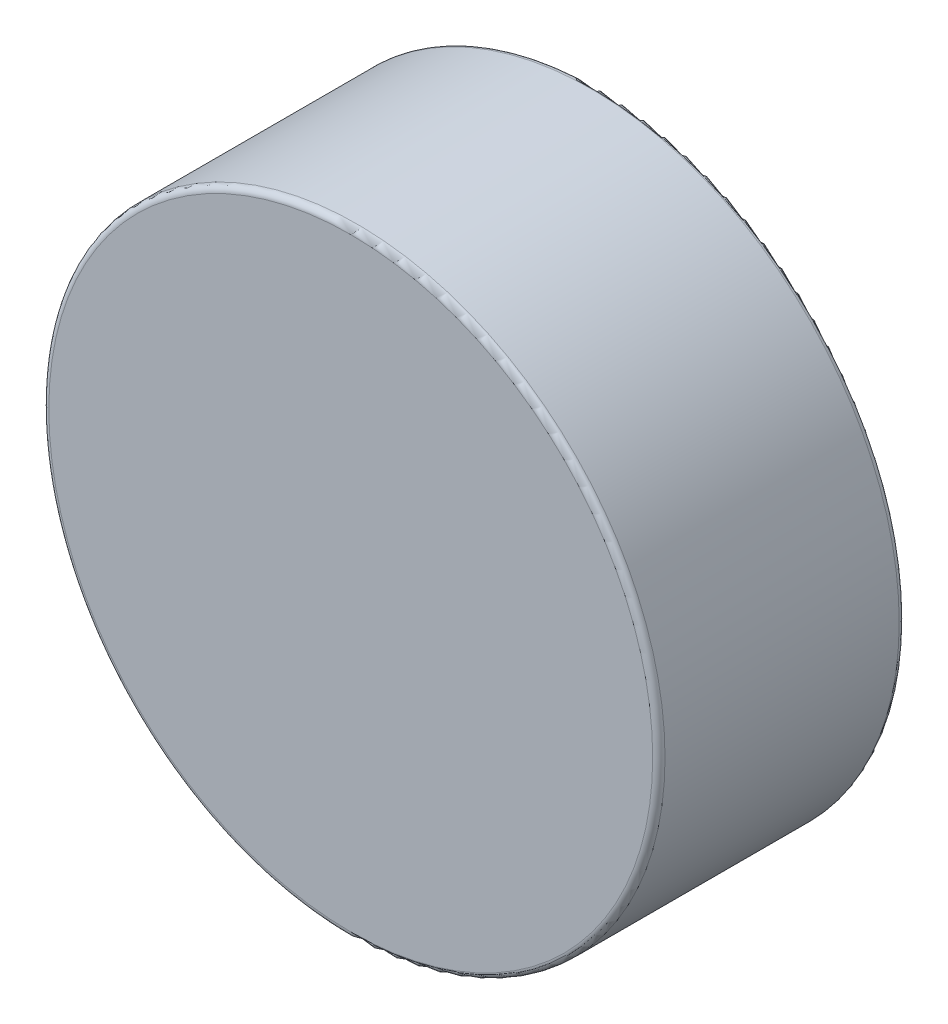
ISO-10303-21;
HEADER;
FILE_DESCRIPTION(('STEP AP214'),'2;1');
FILE_NAME('part.step','',(''),(''),'','','');
FILE_SCHEMA(('AUTOMOTIVE_DESIGN { 1 0 10303 214 1 1 1 1 }'));
ENDSEC;
DATA;
#1=APPLICATION_CONTEXT('core data for automotive mechanical design processes');
#2=APPLICATION_PROTOCOL_DEFINITION('international standard','automotive_design',2000,#1);
#3=PRODUCT_CONTEXT('',#1,'mechanical');
#4=PRODUCT('Part','Part','',(#3));
#5=PRODUCT_RELATED_PRODUCT_CATEGORY('part','',(#4));
#6=PRODUCT_DEFINITION_FORMATION('','',#4);
#7=PRODUCT_DEFINITION_CONTEXT('part definition',#1,'design');
#8=PRODUCT_DEFINITION('design','',#6,#7);
#9=PRODUCT_DEFINITION_SHAPE('','',#8);
#10=(LENGTH_UNIT() NAMED_UNIT(*) SI_UNIT(.MILLI.,.METRE.));
#11=(NAMED_UNIT(*) PLANE_ANGLE_UNIT() SI_UNIT($,.RADIAN.));
#12=(NAMED_UNIT(*) SI_UNIT($,.STERADIAN.) SOLID_ANGLE_UNIT());
#13=UNCERTAINTY_MEASURE_WITH_UNIT(LENGTH_MEASURE(1.E-05),#10,'distance_accuracy_value','');
#14=(GEOMETRIC_REPRESENTATION_CONTEXT(3) GLOBAL_UNCERTAINTY_ASSIGNED_CONTEXT((#13)) GLOBAL_UNIT_ASSIGNED_CONTEXT((#10,
#11,#12)) REPRESENTATION_CONTEXT('',''));
#15=CARTESIAN_POINT('',(0.,0.,0.));
#16=DIRECTION('',(0.,0.,1.));
#17=DIRECTION('',(1.,0.,0.));
#18=AXIS2_PLACEMENT_3D('',#15,#16,#17);
#19=CARTESIAN_POINT('',(0.,0.,1.5875));
#20=DIRECTION('',(0.,0.,-1.));
#21=DIRECTION('',(-1.,0.,0.));
#22=AXIS2_PLACEMENT_3D('',#19,#20,#21);
#23=CYLINDRICAL_SURFACE('',#22,3.96875);
#24=CARTESIAN_POINT('',(0.,0.,-1.508125));
#25=DIRECTION('',(0.,0.,1.));
#26=DIRECTION('',(1.,0.,0.));
#27=AXIS2_PLACEMENT_3D('',#24,#25,#26);
#28=CIRCLE('',#27,3.96875);
#29=CARTESIAN_POINT('',(3.96875,0.,-1.508125));
#30=VERTEX_POINT('',#29);
#31=EDGE_CURVE('E45',#30,#30,#28,.T.);
#32=ORIENTED_EDGE('',*,*,#31,.T.);
#33=EDGE_LOOP('',(#32));
#34=FACE_BOUND('',#33,.T.);
#35=CARTESIAN_POINT('',(0.,0.,1.508125));
#36=DIRECTION('',(0.,0.,1.));
#37=DIRECTION('',(1.,0.,0.));
#38=AXIS2_PLACEMENT_3D('',#35,#36,#37);
#39=CIRCLE('',#38,3.96875);
#40=CARTESIAN_POINT('',(3.96875,0.,1.508125));
#41=VERTEX_POINT('',#40);
#42=EDGE_CURVE('E49',#41,#41,#39,.F.);
#43=ORIENTED_EDGE('',*,*,#42,.T.);
#44=EDGE_LOOP('',(#43));
#45=FACE_BOUND('',#44,.T.);
#46=ADVANCED_FACE('F34',(#34,#45),#23,.T.);
#47=CARTESIAN_POINT('',(0.,0.,1.5875));
#48=DIRECTION('',(0.,0.,1.));
#49=DIRECTION('',(1.,0.,0.));
#50=AXIS2_PLACEMENT_3D('',#47,#48,#49);
#51=PLANE('',#50);
#52=CARTESIAN_POINT('',(0.,0.,1.5875));
#53=DIRECTION('',(0.,0.,1.));
#54=DIRECTION('',(1.,0.,0.));
#55=AXIS2_PLACEMENT_3D('',#52,#53,#54);
#56=CIRCLE('',#55,3.889375);
#57=CARTESIAN_POINT('',(3.889375,0.,1.5875));
#58=VERTEX_POINT('',#57);
#59=EDGE_CURVE('E10',#58,#58,#56,.T.);
#60=ORIENTED_EDGE('',*,*,#59,.T.);
#61=EDGE_LOOP('',(#60));
#62=FACE_BOUND('',#61,.T.);
#63=ADVANCED_FACE('F65',(#62),#51,.T.);
#64=CARTESIAN_POINT('',(0.,0.,-1.5875));
#65=DIRECTION('',(0.,0.,1.));
#66=DIRECTION('',(1.,0.,0.));
#67=AXIS2_PLACEMENT_3D('',#64,#65,#66);
#68=PLANE('',#67);
#69=CARTESIAN_POINT('',(0.,0.,-1.5875));
#70=DIRECTION('',(0.,0.,1.));
#71=DIRECTION('',(1.,0.,0.));
#72=AXIS2_PLACEMENT_3D('',#69,#70,#71);
#73=CIRCLE('',#72,3.889375);
#74=CARTESIAN_POINT('',(3.889375,0.,-1.5875));
#75=VERTEX_POINT('',#74);
#76=EDGE_CURVE('E41',#75,#75,#73,.F.);
#77=ORIENTED_EDGE('',*,*,#76,.T.);
#78=EDGE_LOOP('',(#77));
#79=FACE_BOUND('',#78,.T.);
#80=ADVANCED_FACE('F62',(#79),#68,.F.);
#81=CARTESIAN_POINT('',(0.,0.,-1.508125));
#82=DIRECTION('',(0.,0.,1.));
#83=DIRECTION('',(1.,0.,0.));
#84=AXIS2_PLACEMENT_3D('',#81,#82,#83);
#85=TOROIDAL_SURFACE('',#84,3.889375,0.079375);
#86=ORIENTED_EDGE('',*,*,#76,.F.);
#87=EDGE_LOOP('',(#86));
#88=FACE_BOUND('',#87,.T.);
#89=ORIENTED_EDGE('',*,*,#31,.F.);
#90=EDGE_LOOP('',(#89));
#91=FACE_BOUND('',#90,.T.);
#92=ADVANCED_FACE('F58',(#88,#91),#85,.T.);
#93=CARTESIAN_POINT('',(0.,0.,1.508125));
#94=DIRECTION('',(0.,0.,1.));
#95=DIRECTION('',(1.,0.,0.));
#96=AXIS2_PLACEMENT_3D('',#93,#94,#95);
#97=TOROIDAL_SURFACE('',#96,3.889375,0.079375);
#98=ORIENTED_EDGE('',*,*,#42,.F.);
#99=EDGE_LOOP('',(#98));
#100=FACE_BOUND('',#99,.T.);
#101=ORIENTED_EDGE('',*,*,#59,.F.);
#102=EDGE_LOOP('',(#101));
#103=FACE_BOUND('',#102,.T.);
#104=ADVANCED_FACE('F36',(#100,#103),#97,.T.);
#105=CLOSED_SHELL('',(#46,#63,#80,#92,#104));
#106=MANIFOLD_SOLID_BREP('B2',#105);
#107=ADVANCED_BREP_SHAPE_REPRESENTATION('',(#18,#106),#14);
#108=SHAPE_DEFINITION_REPRESENTATION(#9,#107);
ENDSEC;
END-ISO-10303-21;
